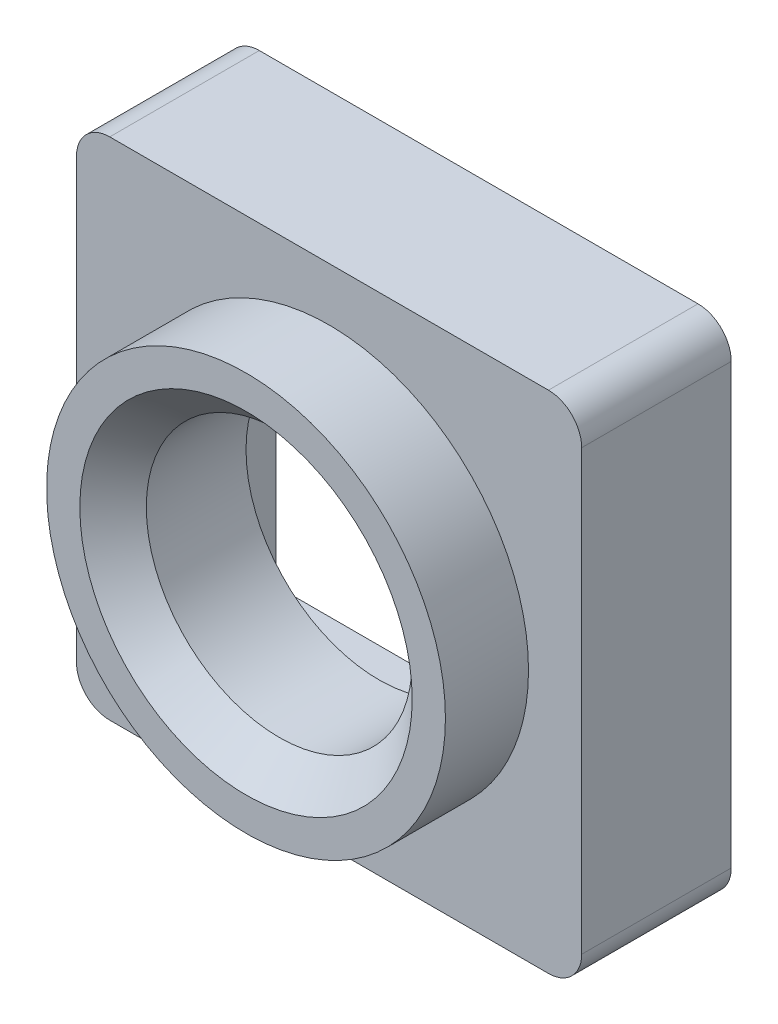
ISO-10303-21;
HEADER;
FILE_DESCRIPTION(('STEP AP214'),'2;1');
FILE_NAME('part.step','',(''),(''),'','','');
FILE_SCHEMA(('AUTOMOTIVE_DESIGN { 1 0 10303 214 1 1 1 1 }'));
ENDSEC;
DATA;
#1=APPLICATION_CONTEXT('core data for automotive mechanical design processes');
#2=APPLICATION_PROTOCOL_DEFINITION('international standard','automotive_design',2000,#1);
#3=PRODUCT_CONTEXT('',#1,'mechanical');
#4=PRODUCT('Part','Part','',(#3));
#5=PRODUCT_RELATED_PRODUCT_CATEGORY('part','',(#4));
#6=PRODUCT_DEFINITION_FORMATION('','',#4);
#7=PRODUCT_DEFINITION_CONTEXT('part definition',#1,'design');
#8=PRODUCT_DEFINITION('design','',#6,#7);
#9=PRODUCT_DEFINITION_SHAPE('','',#8);
#10=(LENGTH_UNIT() NAMED_UNIT(*) SI_UNIT(.MILLI.,.METRE.));
#11=(NAMED_UNIT(*) PLANE_ANGLE_UNIT() SI_UNIT($,.RADIAN.));
#12=(NAMED_UNIT(*) SI_UNIT($,.STERADIAN.) SOLID_ANGLE_UNIT());
#13=UNCERTAINTY_MEASURE_WITH_UNIT(LENGTH_MEASURE(1.E-05),#10,'distance_accuracy_value','');
#14=(GEOMETRIC_REPRESENTATION_CONTEXT(3) GLOBAL_UNCERTAINTY_ASSIGNED_CONTEXT((#13)) GLOBAL_UNIT_ASSIGNED_CONTEXT((#10,
#11,#12)) REPRESENTATION_CONTEXT('',''));
#15=CARTESIAN_POINT('',(0.,0.,0.));
#16=DIRECTION('',(0.,0.,1.));
#17=DIRECTION('',(1.,0.,0.));
#18=AXIS2_PLACEMENT_3D('',#15,#16,#17);
#19=CARTESIAN_POINT('',(0.,0.,2.5));
#20=DIRECTION('',(0.,0.,1.));
#21=DIRECTION('',(1.,0.,0.));
#22=AXIS2_PLACEMENT_3D('',#19,#20,#21);
#23=PLANE('',#22);
#24=CARTESIAN_POINT('',(0.,0.,2.5));
#25=DIRECTION('',(0.,0.,1.));
#26=DIRECTION('',(1.,0.,0.));
#27=AXIS2_PLACEMENT_3D('',#24,#25,#26);
#28=CIRCLE('',#27,5.);
#29=CARTESIAN_POINT('',(5.,0.,2.5));
#30=VERTEX_POINT('',#29);
#31=EDGE_CURVE('E198',#30,#30,#28,.F.);
#32=ORIENTED_EDGE('',*,*,#31,.T.);
#33=EDGE_LOOP('',(#32));
#34=FACE_BOUND('',#33,.T.);
#35=CARTESIAN_POINT('',(0.,0.,2.5));
#36=DIRECTION('',(0.,0.,1.));
#37=DIRECTION('',(1.,0.,0.));
#38=AXIS2_PLACEMENT_3D('',#35,#36,#37);
#39=CIRCLE('',#38,6.);
#40=CARTESIAN_POINT('',(6.,0.,2.5));
#41=VERTEX_POINT('',#40);
#42=EDGE_CURVE('E190',#41,#41,#39,.T.);
#43=ORIENTED_EDGE('',*,*,#42,.T.);
#44=EDGE_LOOP('',(#43));
#45=FACE_BOUND('',#44,.T.);
#46=ADVANCED_FACE('F35',(#34,#45),#23,.T.);
#47=CARTESIAN_POINT('',(0.,0.,2.5));
#48=DIRECTION('',(0.,0.,-1.));
#49=DIRECTION('',(-1.,0.,0.));
#50=AXIS2_PLACEMENT_3D('',#47,#48,#49);
#51=CYLINDRICAL_SURFACE('',#50,6.);
#52=ORIENTED_EDGE('',*,*,#42,.F.);
#53=EDGE_LOOP('',(#52));
#54=FACE_BOUND('',#53,.T.);
#55=CARTESIAN_POINT('',(0.,0.,0.));
#56=DIRECTION('',(0.,0.,1.));
#57=DIRECTION('',(1.,0.,0.));
#58=AXIS2_PLACEMENT_3D('',#55,#56,#57);
#59=CIRCLE('',#58,6.);
#60=CARTESIAN_POINT('',(6.,0.,0.));
#61=VERTEX_POINT('',#60);
#62=EDGE_CURVE('E189',#61,#61,#59,.T.);
#63=ORIENTED_EDGE('',*,*,#62,.T.);
#64=EDGE_LOOP('',(#63));
#65=FACE_BOUND('',#64,.T.);
#66=ADVANCED_FACE('F336',(#54,#65),#51,.T.);
#67=CARTESIAN_POINT('',(0.,0.,2.5));
#68=DIRECTION('',(0.,0.,-1.));
#69=DIRECTION('',(-1.,0.,0.));
#70=AXIS2_PLACEMENT_3D('',#67,#68,#69);
#71=CYLINDRICAL_SURFACE('',#70,4.);
#72=CARTESIAN_POINT('',(0.,0.,1.5));
#73=DIRECTION('',(0.,0.,1.));
#74=DIRECTION('',(1.,0.,0.));
#75=AXIS2_PLACEMENT_3D('',#72,#73,#74);
#76=CIRCLE('',#75,4.);
#77=CARTESIAN_POINT('',(4.,0.,1.5));
#78=VERTEX_POINT('',#77);
#79=EDGE_CURVE('E193',#78,#78,#76,.T.);
#80=ORIENTED_EDGE('',*,*,#79,.T.);
#81=EDGE_LOOP('',(#80));
#82=FACE_BOUND('',#81,.T.);
#83=CARTESIAN_POINT('',(0.,0.,-1.5));
#84=DIRECTION('',(0.,0.,-1.));
#85=DIRECTION('',(-1.,0.,0.));
#86=AXIS2_PLACEMENT_3D('',#83,#84,#85);
#87=CIRCLE('',#86,4.);
#88=CARTESIAN_POINT('',(-4.,0.,-1.5));
#89=VERTEX_POINT('',#88);
#90=EDGE_CURVE('E175',#89,#89,#87,.T.);
#91=ORIENTED_EDGE('',*,*,#90,.T.);
#92=EDGE_LOOP('',(#91));
#93=FACE_BOUND('',#92,.T.);
#94=ADVANCED_FACE('F342',(#82,#93),#71,.F.);
#95=CARTESIAN_POINT('',(0.,0.,1.5));
#96=DIRECTION('',(0.,0.,1.));
#97=DIRECTION('',(1.,0.,0.));
#98=AXIS2_PLACEMENT_3D('',#95,#96,#97);
#99=CONICAL_SURFACE('',#98,4.,0.785398163397449);
#100=ORIENTED_EDGE('',*,*,#31,.F.);
#101=EDGE_LOOP('',(#100));
#102=FACE_BOUND('',#101,.T.);
#103=ORIENTED_EDGE('',*,*,#79,.F.);
#104=EDGE_LOOP('',(#103));
#105=FACE_BOUND('',#104,.T.);
#106=ADVANCED_FACE('F349',(#102,#105),#99,.F.);
#107=CARTESIAN_POINT('',(0.,0.,-1.5));
#108=DIRECTION('',(0.,0.,1.));
#109=DIRECTION('',(1.,0.,0.));
#110=AXIS2_PLACEMENT_3D('',#107,#108,#109);
#111=PLANE('',#110);
#112=DIRECTION('',(-1.,0.,0.));
#113=VECTOR('',#112,1.);
#114=CARTESIAN_POINT('',(6.1,-6.1,-1.5));
#115=LINE('',#114,#113);
#116=CARTESIAN_POINT('',(5.6,-6.1,-1.5));
#117=VERTEX_POINT('',#116);
#118=CARTESIAN_POINT('',(-5.6,-6.1,-1.5));
#119=VERTEX_POINT('',#118);
#120=EDGE_CURVE('E280',#117,#119,#115,.T.);
#121=ORIENTED_EDGE('',*,*,#120,.T.);
#122=CARTESIAN_POINT('',(-5.6,-5.6,-1.5));
#123=DIRECTION('',(0.,0.,1.));
#124=DIRECTION('',(1.,0.,0.));
#125=AXIS2_PLACEMENT_3D('',#122,#123,#124);
#126=CIRCLE('',#125,0.5);
#127=CARTESIAN_POINT('',(-6.1,-5.6,-1.5));
#128=VERTEX_POINT('',#127);
#129=EDGE_CURVE('E238',#119,#128,#126,.F.);
#130=ORIENTED_EDGE('',*,*,#129,.T.);
#131=DIRECTION('',(0.,1.,0.));
#132=VECTOR('',#131,1.);
#133=CARTESIAN_POINT('',(-6.1,-6.1,-1.5));
#134=LINE('',#133,#132);
#135=CARTESIAN_POINT('',(-6.1,5.6,-1.5));
#136=VERTEX_POINT('',#135);
#137=EDGE_CURVE('E467',#128,#136,#134,.T.);
#138=ORIENTED_EDGE('',*,*,#137,.T.);
#139=CARTESIAN_POINT('',(-5.6,5.6,-1.5));
#140=DIRECTION('',(0.,0.,1.));
#141=DIRECTION('',(1.,0.,0.));
#142=AXIS2_PLACEMENT_3D('',#139,#140,#141);
#143=CIRCLE('',#142,0.5);
#144=CARTESIAN_POINT('',(-5.6,6.1,-1.5));
#145=VERTEX_POINT('',#144);
#146=EDGE_CURVE('E232',#136,#145,#143,.F.);
#147=ORIENTED_EDGE('',*,*,#146,.T.);
#148=DIRECTION('',(1.,0.,0.));
#149=VECTOR('',#148,1.);
#150=CARTESIAN_POINT('',(-6.1,6.1,-1.5));
#151=LINE('',#150,#149);
#152=CARTESIAN_POINT('',(5.6,6.1,-1.5));
#153=VERTEX_POINT('',#152);
#154=EDGE_CURVE('E289',#145,#153,#151,.T.);
#155=ORIENTED_EDGE('',*,*,#154,.T.);
#156=CARTESIAN_POINT('',(5.6,5.6,-1.5));
#157=DIRECTION('',(0.,0.,1.));
#158=DIRECTION('',(1.,0.,0.));
#159=AXIS2_PLACEMENT_3D('',#156,#157,#158);
#160=CIRCLE('',#159,0.5);
#161=CARTESIAN_POINT('',(6.1,5.6,-1.5));
#162=VERTEX_POINT('',#161);
#163=EDGE_CURVE('E234',#153,#162,#160,.F.);
#164=ORIENTED_EDGE('',*,*,#163,.T.);
#165=DIRECTION('',(0.,-1.,0.));
#166=VECTOR('',#165,1.);
#167=CARTESIAN_POINT('',(6.1,6.1,-1.5));
#168=LINE('',#167,#166);
#169=CARTESIAN_POINT('',(6.1,-5.6,-1.5));
#170=VERTEX_POINT('',#169);
#171=EDGE_CURVE('E281',#162,#170,#168,.T.);
#172=ORIENTED_EDGE('',*,*,#171,.T.);
#173=CARTESIAN_POINT('',(5.6,-5.6,-1.5));
#174=DIRECTION('',(0.,0.,1.));
#175=DIRECTION('',(1.,0.,0.));
#176=AXIS2_PLACEMENT_3D('',#173,#174,#175);
#177=CIRCLE('',#176,0.5);
#178=EDGE_CURVE('E236',#170,#117,#177,.F.);
#179=ORIENTED_EDGE('',*,*,#178,.T.);
#180=EDGE_LOOP('',(#121,#130,#138,#147,#155,#164,#172,#179));
#181=FACE_BOUND('',#180,.T.);
#182=ORIENTED_EDGE('',*,*,#90,.F.);
#183=EDGE_LOOP('',(#182));
#184=FACE_BOUND('',#183,.T.);
#185=ADVANCED_FACE('F278',(#181,#184),#111,.F.);
#186=CARTESIAN_POINT('',(0.,0.,0.));
#187=DIRECTION('',(0.,0.,1.));
#188=DIRECTION('',(1.,0.,0.));
#189=AXIS2_PLACEMENT_3D('',#186,#187,#188);
#190=PLANE('',#189);
#191=ORIENTED_EDGE('',*,*,#62,.F.);
#192=EDGE_LOOP('',(#191));
#193=FACE_BOUND('',#192,.T.);
#194=DIRECTION('',(0.,1.,0.));
#195=VECTOR('',#194,1.);
#196=CARTESIAN_POINT('',(-7.6,-7.6,0.));
#197=LINE('',#196,#195);
#198=CARTESIAN_POINT('',(-7.6,-6.6,0.));
#199=VERTEX_POINT('',#198);
#200=CARTESIAN_POINT('',(-7.6,6.6,0.));
#201=VERTEX_POINT('',#200);
#202=EDGE_CURVE('E165',#199,#201,#197,.T.);
#203=ORIENTED_EDGE('',*,*,#202,.F.);
#204=CARTESIAN_POINT('',(-6.6,-6.6,0.));
#205=DIRECTION('',(0.,0.,1.));
#206=DIRECTION('',(1.,0.,0.));
#207=AXIS2_PLACEMENT_3D('',#204,#205,#206);
#208=CIRCLE('',#207,1.);
#209=CARTESIAN_POINT('',(-6.6,-7.6,0.));
#210=VERTEX_POINT('',#209);
#211=EDGE_CURVE('E148',#199,#210,#208,.T.);
#212=ORIENTED_EDGE('',*,*,#211,.T.);
#213=DIRECTION('',(-1.,0.,0.));
#214=VECTOR('',#213,1.);
#215=CARTESIAN_POINT('',(7.6,-7.6,0.));
#216=LINE('',#215,#214);
#217=CARTESIAN_POINT('',(6.6,-7.6,0.));
#218=VERTEX_POINT('',#217);
#219=EDGE_CURVE('E187',#218,#210,#216,.T.);
#220=ORIENTED_EDGE('',*,*,#219,.F.);
#221=CARTESIAN_POINT('',(6.6,-6.6,0.));
#222=DIRECTION('',(0.,0.,1.));
#223=DIRECTION('',(1.,0.,0.));
#224=AXIS2_PLACEMENT_3D('',#221,#222,#223);
#225=CIRCLE('',#224,1.);
#226=CARTESIAN_POINT('',(7.6,-6.6,0.));
#227=VERTEX_POINT('',#226);
#228=EDGE_CURVE('E159',#218,#227,#225,.T.);
#229=ORIENTED_EDGE('',*,*,#228,.T.);
#230=DIRECTION('',(0.,-1.,0.));
#231=VECTOR('',#230,1.);
#232=CARTESIAN_POINT('',(7.6,-7.6,0.));
#233=LINE('',#232,#231);
#234=CARTESIAN_POINT('',(7.6,6.6,0.));
#235=VERTEX_POINT('',#234);
#236=EDGE_CURVE('E178',#235,#227,#233,.T.);
#237=ORIENTED_EDGE('',*,*,#236,.F.);
#238=CARTESIAN_POINT('',(6.6,6.6,0.));
#239=DIRECTION('',(0.,0.,1.));
#240=DIRECTION('',(1.,0.,0.));
#241=AXIS2_PLACEMENT_3D('',#238,#239,#240);
#242=CIRCLE('',#241,1.);
#243=CARTESIAN_POINT('',(6.6,7.6,0.));
#244=VERTEX_POINT('',#243);
#245=EDGE_CURVE('E203',#235,#244,#242,.T.);
#246=ORIENTED_EDGE('',*,*,#245,.T.);
#247=DIRECTION('',(1.,0.,0.));
#248=VECTOR('',#247,1.);
#249=CARTESIAN_POINT('',(7.6,7.6,0.));
#250=LINE('',#249,#248);
#251=CARTESIAN_POINT('',(-6.6,7.6,0.));
#252=VERTEX_POINT('',#251);
#253=EDGE_CURVE('E174',#252,#244,#250,.T.);
#254=ORIENTED_EDGE('',*,*,#253,.F.);
#255=CARTESIAN_POINT('',(-6.6,6.6,0.));
#256=DIRECTION('',(0.,0.,1.));
#257=DIRECTION('',(1.,0.,0.));
#258=AXIS2_PLACEMENT_3D('',#255,#256,#257);
#259=CIRCLE('',#258,1.);
#260=EDGE_CURVE('E169',#252,#201,#259,.T.);
#261=ORIENTED_EDGE('',*,*,#260,.T.);
#262=EDGE_LOOP('',(#203,#212,#220,#229,#237,#246,#254,#261));
#263=FACE_BOUND('',#262,.T.);
#264=ADVANCED_FACE('F172',(#193,#263),#190,.T.);
#265=CARTESIAN_POINT('',(-7.6,-7.6,-1.5));
#266=DIRECTION('',(1.,0.,0.));
#267=DIRECTION('',(0.,1.,0.));
#268=AXIS2_PLACEMENT_3D('',#265,#266,#267);
#269=PLANE('',#268);
#270=DIRECTION('',(0.,1.,0.));
#271=VECTOR('',#270,1.);
#272=CARTESIAN_POINT('',(-7.6,-7.6,-4.5));
#273=LINE('',#272,#271);
#274=CARTESIAN_POINT('',(-7.6,-6.6,-4.5));
#275=VERTEX_POINT('',#274);
#276=CARTESIAN_POINT('',(-7.6,6.6,-4.5));
#277=VERTEX_POINT('',#276);
#278=EDGE_CURVE('E168',#275,#277,#273,.T.);
#279=ORIENTED_EDGE('',*,*,#278,.F.);
#280=DIRECTION('',(0.,0.,1.));
#281=VECTOR('',#280,1.);
#282=CARTESIAN_POINT('',(-7.6,-6.6,-1.5));
#283=LINE('',#282,#281);
#284=EDGE_CURVE('E152',#275,#199,#283,.T.);
#285=ORIENTED_EDGE('',*,*,#284,.T.);
#286=ORIENTED_EDGE('',*,*,#202,.T.);
#287=DIRECTION('',(0.,0.,1.));
#288=VECTOR('',#287,1.);
#289=CARTESIAN_POINT('',(-7.6,6.6,-1.5));
#290=LINE('',#289,#288);
#291=EDGE_CURVE('E170',#201,#277,#290,.F.);
#292=ORIENTED_EDGE('',*,*,#291,.T.);
#293=EDGE_LOOP('',(#279,#285,#286,#292));
#294=FACE_BOUND('',#293,.T.);
#295=ADVANCED_FACE('F164',(#294),#269,.F.);
#296=CARTESIAN_POINT('',(7.6,7.6,-1.5));
#297=DIRECTION('',(0.,-1.,0.));
#298=DIRECTION('',(1.,0.,0.));
#299=AXIS2_PLACEMENT_3D('',#296,#297,#298);
#300=PLANE('',#299);
#301=ORIENTED_EDGE('',*,*,#253,.T.);
#302=DIRECTION('',(0.,0.,1.));
#303=VECTOR('',#302,1.);
#304=CARTESIAN_POINT('',(6.6,7.6,-1.5));
#305=LINE('',#304,#303);
#306=CARTESIAN_POINT('',(6.6,7.6,-4.5));
#307=VERTEX_POINT('',#306);
#308=EDGE_CURVE('E225',#244,#307,#305,.F.);
#309=ORIENTED_EDGE('',*,*,#308,.T.);
#310=DIRECTION('',(1.,0.,0.));
#311=VECTOR('',#310,1.);
#312=CARTESIAN_POINT('',(-7.6,7.6,-4.5));
#313=LINE('',#312,#311);
#314=CARTESIAN_POINT('',(-6.6,7.6,-4.5));
#315=VERTEX_POINT('',#314);
#316=EDGE_CURVE('E297',#315,#307,#313,.T.);
#317=ORIENTED_EDGE('',*,*,#316,.F.);
#318=DIRECTION('',(0.,0.,1.));
#319=VECTOR('',#318,1.);
#320=CARTESIAN_POINT('',(-6.6,7.6,-1.5));
#321=LINE('',#320,#319);
#322=EDGE_CURVE('E222',#315,#252,#321,.T.);
#323=ORIENTED_EDGE('',*,*,#322,.T.);
#324=EDGE_LOOP('',(#301,#309,#317,#323));
#325=FACE_BOUND('',#324,.T.);
#326=ADVANCED_FACE('F319',(#325),#300,.F.);
#327=CARTESIAN_POINT('',(7.6,-7.6,-1.5));
#328=DIRECTION('',(-1.,0.,0.));
#329=DIRECTION('',(0.,-1.,0.));
#330=AXIS2_PLACEMENT_3D('',#327,#328,#329);
#331=PLANE('',#330);
#332=ORIENTED_EDGE('',*,*,#236,.T.);
#333=DIRECTION('',(0.,0.,1.));
#334=VECTOR('',#333,1.);
#335=CARTESIAN_POINT('',(7.6,-6.6,-1.5));
#336=LINE('',#335,#334);
#337=CARTESIAN_POINT('',(7.6,-6.6,-4.5));
#338=VERTEX_POINT('',#337);
#339=EDGE_CURVE('E220',#227,#338,#336,.F.);
#340=ORIENTED_EDGE('',*,*,#339,.T.);
#341=DIRECTION('',(0.,-1.,0.));
#342=VECTOR('',#341,1.);
#343=CARTESIAN_POINT('',(7.6,7.6,-4.5));
#344=LINE('',#343,#342);
#345=CARTESIAN_POINT('',(7.6,6.6,-4.5));
#346=VERTEX_POINT('',#345);
#347=EDGE_CURVE('E181',#346,#338,#344,.T.);
#348=ORIENTED_EDGE('',*,*,#347,.F.);
#349=DIRECTION('',(0.,0.,1.));
#350=VECTOR('',#349,1.);
#351=CARTESIAN_POINT('',(7.6,6.6,-1.5));
#352=LINE('',#351,#350);
#353=EDGE_CURVE('E217',#346,#235,#352,.T.);
#354=ORIENTED_EDGE('',*,*,#353,.T.);
#355=EDGE_LOOP('',(#332,#340,#348,#354));
#356=FACE_BOUND('',#355,.T.);
#357=ADVANCED_FACE('F314',(#356),#331,.F.);
#358=CARTESIAN_POINT('',(7.6,-7.6,-1.5));
#359=DIRECTION('',(0.,1.,0.));
#360=DIRECTION('',(0.,0.,1.));
#361=AXIS2_PLACEMENT_3D('',#358,#359,#360);
#362=PLANE('',#361);
#363=ORIENTED_EDGE('',*,*,#219,.T.);
#364=DIRECTION('',(0.,0.,1.));
#365=VECTOR('',#364,1.);
#366=CARTESIAN_POINT('',(-6.6,-7.6,-1.5));
#367=LINE('',#366,#365);
#368=CARTESIAN_POINT('',(-6.6,-7.6,-4.5));
#369=VERTEX_POINT('',#368);
#370=EDGE_CURVE('E153',#210,#369,#367,.F.);
#371=ORIENTED_EDGE('',*,*,#370,.T.);
#372=DIRECTION('',(-1.,0.,0.));
#373=VECTOR('',#372,1.);
#374=CARTESIAN_POINT('',(7.6,-7.6,-4.5));
#375=LINE('',#374,#373);
#376=CARTESIAN_POINT('',(6.6,-7.6,-4.5));
#377=VERTEX_POINT('',#376);
#378=EDGE_CURVE('E293',#377,#369,#375,.T.);
#379=ORIENTED_EDGE('',*,*,#378,.F.);
#380=DIRECTION('',(0.,0.,1.));
#381=VECTOR('',#380,1.);
#382=CARTESIAN_POINT('',(6.6,-7.6,-1.5));
#383=LINE('',#382,#381);
#384=EDGE_CURVE('E158',#377,#218,#383,.T.);
#385=ORIENTED_EDGE('',*,*,#384,.T.);
#386=EDGE_LOOP('',(#363,#371,#379,#385));
#387=FACE_BOUND('',#386,.T.);
#388=ADVANCED_FACE('F312',(#387),#362,.F.);
#389=CARTESIAN_POINT('',(0.,0.,-4.5));
#390=DIRECTION('',(0.,0.,-1.));
#391=DIRECTION('',(-1.,0.,0.));
#392=AXIS2_PLACEMENT_3D('',#389,#390,#391);
#393=PLANE('',#392);
#394=ORIENTED_EDGE('',*,*,#378,.T.);
#395=CARTESIAN_POINT('',(-6.6,-6.6,-4.5));
#396=DIRECTION('',(0.,0.,-1.));
#397=DIRECTION('',(-1.,0.,0.));
#398=AXIS2_PLACEMENT_3D('',#395,#396,#397);
#399=CIRCLE('',#398,1.);
#400=EDGE_CURVE('E215',#369,#275,#399,.T.);
#401=ORIENTED_EDGE('',*,*,#400,.T.);
#402=ORIENTED_EDGE('',*,*,#278,.T.);
#403=CARTESIAN_POINT('',(-6.6,6.6,-4.5));
#404=DIRECTION('',(0.,0.,-1.));
#405=DIRECTION('',(-1.,0.,0.));
#406=AXIS2_PLACEMENT_3D('',#403,#404,#405);
#407=CIRCLE('',#406,1.);
#408=EDGE_CURVE('E209',#277,#315,#407,.T.);
#409=ORIENTED_EDGE('',*,*,#408,.T.);
#410=ORIENTED_EDGE('',*,*,#316,.T.);
#411=CARTESIAN_POINT('',(6.6,6.6,-4.5));
#412=DIRECTION('',(0.,0.,-1.));
#413=DIRECTION('',(-1.,0.,0.));
#414=AXIS2_PLACEMENT_3D('',#411,#412,#413);
#415=CIRCLE('',#414,1.);
#416=EDGE_CURVE('E211',#307,#346,#415,.T.);
#417=ORIENTED_EDGE('',*,*,#416,.T.);
#418=ORIENTED_EDGE('',*,*,#347,.T.);
#419=CARTESIAN_POINT('',(6.6,-6.6,-4.5));
#420=DIRECTION('',(0.,0.,-1.));
#421=DIRECTION('',(-1.,0.,0.));
#422=AXIS2_PLACEMENT_3D('',#419,#420,#421);
#423=CIRCLE('',#422,1.);
#424=EDGE_CURVE('E213',#338,#377,#423,.T.);
#425=ORIENTED_EDGE('',*,*,#424,.T.);
#426=EDGE_LOOP('',(#394,#401,#402,#409,#410,#417,#418,#425));
#427=FACE_BOUND('',#426,.T.);
#428=DIRECTION('',(1.,0.,0.));
#429=VECTOR('',#428,1.);
#430=CARTESIAN_POINT('',(-6.1,6.1,-4.5));
#431=LINE('',#430,#429);
#432=CARTESIAN_POINT('',(-5.6,6.1,-4.5));
#433=VERTEX_POINT('',#432);
#434=CARTESIAN_POINT('',(5.6,6.1,-4.5));
#435=VERTEX_POINT('',#434);
#436=EDGE_CURVE('E272',#433,#435,#431,.T.);
#437=ORIENTED_EDGE('',*,*,#436,.F.);
#438=CARTESIAN_POINT('',(-5.6,5.6,-4.5));
#439=DIRECTION('',(0.,0.,-1.));
#440=DIRECTION('',(-1.,0.,0.));
#441=AXIS2_PLACEMENT_3D('',#438,#439,#440);
#442=CIRCLE('',#441,0.5);
#443=CARTESIAN_POINT('',(-6.1,5.6,-4.5));
#444=VERTEX_POINT('',#443);
#445=EDGE_CURVE('E11',#433,#444,#442,.F.);
#446=ORIENTED_EDGE('',*,*,#445,.T.);
#447=DIRECTION('',(0.,1.,0.));
#448=VECTOR('',#447,1.);
#449=CARTESIAN_POINT('',(-6.1,-6.1,-4.5));
#450=LINE('',#449,#448);
#451=CARTESIAN_POINT('',(-6.1,-5.6,-4.5));
#452=VERTEX_POINT('',#451);
#453=EDGE_CURVE('E285',#452,#444,#450,.T.);
#454=ORIENTED_EDGE('',*,*,#453,.F.);
#455=CARTESIAN_POINT('',(-5.6,-5.6,-4.5));
#456=DIRECTION('',(0.,0.,-1.));
#457=DIRECTION('',(-1.,0.,0.));
#458=AXIS2_PLACEMENT_3D('',#455,#456,#457);
#459=CIRCLE('',#458,0.5);
#460=CARTESIAN_POINT('',(-5.6,-6.1,-4.5));
#461=VERTEX_POINT('',#460);
#462=EDGE_CURVE('E254',#452,#461,#459,.F.);
#463=ORIENTED_EDGE('',*,*,#462,.T.);
#464=DIRECTION('',(-1.,0.,0.));
#465=VECTOR('',#464,1.);
#466=CARTESIAN_POINT('',(6.1,-6.1,-4.5));
#467=LINE('',#466,#465);
#468=CARTESIAN_POINT('',(5.6,-6.1,-4.5));
#469=VERTEX_POINT('',#468);
#470=EDGE_CURVE('E263',#469,#461,#467,.T.);
#471=ORIENTED_EDGE('',*,*,#470,.F.);
#472=CARTESIAN_POINT('',(5.6,-5.6,-4.5));
#473=DIRECTION('',(0.,0.,-1.));
#474=DIRECTION('',(-1.,0.,0.));
#475=AXIS2_PLACEMENT_3D('',#472,#473,#474);
#476=CIRCLE('',#475,0.5);
#477=CARTESIAN_POINT('',(6.1,-5.6,-4.5));
#478=VERTEX_POINT('',#477);
#479=EDGE_CURVE('E256',#469,#478,#476,.F.);
#480=ORIENTED_EDGE('',*,*,#479,.T.);
#481=DIRECTION('',(0.,-1.,0.));
#482=VECTOR('',#481,1.);
#483=CARTESIAN_POINT('',(6.1,6.1,-4.5));
#484=LINE('',#483,#482);
#485=CARTESIAN_POINT('',(6.1,5.6,-4.5));
#486=VERTEX_POINT('',#485);
#487=EDGE_CURVE('E261',#486,#478,#484,.T.);
#488=ORIENTED_EDGE('',*,*,#487,.F.);
#489=CARTESIAN_POINT('',(5.6,5.6,-4.5));
#490=DIRECTION('',(0.,0.,-1.));
#491=DIRECTION('',(-1.,0.,0.));
#492=AXIS2_PLACEMENT_3D('',#489,#490,#491);
#493=CIRCLE('',#492,0.5);
#494=EDGE_CURVE('E43',#486,#435,#493,.F.);
#495=ORIENTED_EDGE('',*,*,#494,.T.);
#496=EDGE_LOOP('',(#437,#446,#454,#463,#471,#480,#488,#495));
#497=FACE_BOUND('',#496,.T.);
#498=ADVANCED_FACE('F260',(#427,#497),#393,.T.);
#499=CARTESIAN_POINT('',(-6.1,-6.1,-4.5));
#500=DIRECTION('',(1.,0.,0.));
#501=DIRECTION('',(0.,0.,-1.));
#502=AXIS2_PLACEMENT_3D('',#499,#500,#501);
#503=PLANE('',#502);
#504=ORIENTED_EDGE('',*,*,#137,.F.);
#505=DIRECTION('',(0.,0.,1.));
#506=VECTOR('',#505,1.);
#507=CARTESIAN_POINT('',(-6.1,-5.6,-4.5));
#508=LINE('',#507,#506);
#509=EDGE_CURVE('E243',#128,#452,#508,.F.);
#510=ORIENTED_EDGE('',*,*,#509,.T.);
#511=ORIENTED_EDGE('',*,*,#453,.T.);
#512=DIRECTION('',(0.,0.,1.));
#513=VECTOR('',#512,1.);
#514=CARTESIAN_POINT('',(-6.1,5.6,-1.5));
#515=LINE('',#514,#513);
#516=EDGE_CURVE('E240',#444,#136,#515,.T.);
#517=ORIENTED_EDGE('',*,*,#516,.T.);
#518=EDGE_LOOP('',(#504,#510,#511,#517));
#519=FACE_BOUND('',#518,.T.);
#520=ADVANCED_FACE('F390',(#519),#503,.T.);
#521=CARTESIAN_POINT('',(-6.1,6.1,-4.5));
#522=DIRECTION('',(0.,-1.,0.));
#523=DIRECTION('',(0.,0.,-1.));
#524=AXIS2_PLACEMENT_3D('',#521,#522,#523);
#525=PLANE('',#524);
#526=ORIENTED_EDGE('',*,*,#436,.T.);
#527=DIRECTION('',(0.,0.,1.));
#528=VECTOR('',#527,1.);
#529=CARTESIAN_POINT('',(5.6,6.1,-1.5));
#530=LINE('',#529,#528);
#531=EDGE_CURVE('E251',#435,#153,#530,.T.);
#532=ORIENTED_EDGE('',*,*,#531,.T.);
#533=ORIENTED_EDGE('',*,*,#154,.F.);
#534=DIRECTION('',(0.,0.,1.));
#535=VECTOR('',#534,1.);
#536=CARTESIAN_POINT('',(-5.6,6.1,-4.5));
#537=LINE('',#536,#535);
#538=EDGE_CURVE('E56',#145,#433,#537,.F.);
#539=ORIENTED_EDGE('',*,*,#538,.T.);
#540=EDGE_LOOP('',(#526,#532,#533,#539));
#541=FACE_BOUND('',#540,.T.);
#542=ADVANCED_FACE('F401',(#541),#525,.T.);
#543=CARTESIAN_POINT('',(6.1,6.1,-4.5));
#544=DIRECTION('',(-1.,0.,0.));
#545=DIRECTION('',(0.,0.,1.));
#546=AXIS2_PLACEMENT_3D('',#543,#544,#545);
#547=PLANE('',#546);
#548=ORIENTED_EDGE('',*,*,#487,.T.);
#549=DIRECTION('',(0.,0.,1.));
#550=VECTOR('',#549,1.);
#551=CARTESIAN_POINT('',(6.1,-5.6,-1.5));
#552=LINE('',#551,#550);
#553=EDGE_CURVE('E247',#478,#170,#552,.T.);
#554=ORIENTED_EDGE('',*,*,#553,.T.);
#555=ORIENTED_EDGE('',*,*,#171,.F.);
#556=DIRECTION('',(0.,0.,1.));
#557=VECTOR('',#556,1.);
#558=CARTESIAN_POINT('',(6.1,5.6,-4.5));
#559=LINE('',#558,#557);
#560=EDGE_CURVE('E245',#162,#486,#559,.F.);
#561=ORIENTED_EDGE('',*,*,#560,.T.);
#562=EDGE_LOOP('',(#548,#554,#555,#561));
#563=FACE_BOUND('',#562,.T.);
#564=ADVANCED_FACE('F268',(#563),#547,.T.);
#565=CARTESIAN_POINT('',(6.1,-6.1,-4.5));
#566=DIRECTION('',(0.,1.,0.));
#567=DIRECTION('',(0.,0.,1.));
#568=AXIS2_PLACEMENT_3D('',#565,#566,#567);
#569=PLANE('',#568);
#570=ORIENTED_EDGE('',*,*,#470,.T.);
#571=DIRECTION('',(0.,0.,1.));
#572=VECTOR('',#571,1.);
#573=CARTESIAN_POINT('',(-5.6,-6.1,-1.5));
#574=LINE('',#573,#572);
#575=EDGE_CURVE('E229',#461,#119,#574,.T.);
#576=ORIENTED_EDGE('',*,*,#575,.T.);
#577=ORIENTED_EDGE('',*,*,#120,.F.);
#578=DIRECTION('',(0.,0.,1.));
#579=VECTOR('',#578,1.);
#580=CARTESIAN_POINT('',(5.6,-6.1,-4.5));
#581=LINE('',#580,#579);
#582=EDGE_CURVE('E227',#117,#469,#581,.F.);
#583=ORIENTED_EDGE('',*,*,#582,.T.);
#584=EDGE_LOOP('',(#570,#576,#577,#583));
#585=FACE_BOUND('',#584,.T.);
#586=ADVANCED_FACE('F283',(#585),#569,.T.);
#587=CARTESIAN_POINT('',(-6.6,-6.6,-1.5));
#588=DIRECTION('',(0.,0.,1.));
#589=DIRECTION('',(1.,0.,0.));
#590=AXIS2_PLACEMENT_3D('',#587,#588,#589);
#591=CYLINDRICAL_SURFACE('',#590,1.);
#592=ORIENTED_EDGE('',*,*,#400,.F.);
#593=ORIENTED_EDGE('',*,*,#370,.F.);
#594=ORIENTED_EDGE('',*,*,#211,.F.);
#595=ORIENTED_EDGE('',*,*,#284,.F.);
#596=EDGE_LOOP('',(#592,#593,#594,#595));
#597=FACE_BOUND('',#596,.T.);
#598=ADVANCED_FACE('F151',(#597),#591,.T.);
#599=CARTESIAN_POINT('',(6.6,-6.6,-1.5));
#600=DIRECTION('',(0.,0.,1.));
#601=DIRECTION('',(1.,0.,0.));
#602=AXIS2_PLACEMENT_3D('',#599,#600,#601);
#603=CYLINDRICAL_SURFACE('',#602,1.);
#604=ORIENTED_EDGE('',*,*,#424,.F.);
#605=ORIENTED_EDGE('',*,*,#339,.F.);
#606=ORIENTED_EDGE('',*,*,#228,.F.);
#607=ORIENTED_EDGE('',*,*,#384,.F.);
#608=EDGE_LOOP('',(#604,#605,#606,#607));
#609=FACE_BOUND('',#608,.T.);
#610=ADVANCED_FACE('F310',(#609),#603,.T.);
#611=CARTESIAN_POINT('',(6.6,6.6,-1.5));
#612=DIRECTION('',(0.,0.,1.));
#613=DIRECTION('',(1.,0.,0.));
#614=AXIS2_PLACEMENT_3D('',#611,#612,#613);
#615=CYLINDRICAL_SURFACE('',#614,1.);
#616=ORIENTED_EDGE('',*,*,#416,.F.);
#617=ORIENTED_EDGE('',*,*,#308,.F.);
#618=ORIENTED_EDGE('',*,*,#245,.F.);
#619=ORIENTED_EDGE('',*,*,#353,.F.);
#620=EDGE_LOOP('',(#616,#617,#618,#619));
#621=FACE_BOUND('',#620,.T.);
#622=ADVANCED_FACE('F316',(#621),#615,.T.);
#623=CARTESIAN_POINT('',(-6.6,6.6,-1.5));
#624=DIRECTION('',(0.,0.,1.));
#625=DIRECTION('',(1.,0.,0.));
#626=AXIS2_PLACEMENT_3D('',#623,#624,#625);
#627=CYLINDRICAL_SURFACE('',#626,1.);
#628=ORIENTED_EDGE('',*,*,#408,.F.);
#629=ORIENTED_EDGE('',*,*,#291,.F.);
#630=ORIENTED_EDGE('',*,*,#260,.F.);
#631=ORIENTED_EDGE('',*,*,#322,.F.);
#632=EDGE_LOOP('',(#628,#629,#630,#631));
#633=FACE_BOUND('',#632,.T.);
#634=ADVANCED_FACE('F324',(#633),#627,.T.);
#635=CARTESIAN_POINT('',(-5.6,-5.6,-4.5));
#636=DIRECTION('',(0.,0.,-1.));
#637=DIRECTION('',(-1.,0.,0.));
#638=AXIS2_PLACEMENT_3D('',#635,#636,#637);
#639=CYLINDRICAL_SURFACE('',#638,0.5);
#640=ORIENTED_EDGE('',*,*,#462,.F.);
#641=ORIENTED_EDGE('',*,*,#509,.F.);
#642=ORIENTED_EDGE('',*,*,#129,.F.);
#643=ORIENTED_EDGE('',*,*,#575,.F.);
#644=EDGE_LOOP('',(#640,#641,#642,#643));
#645=FACE_BOUND('',#644,.T.);
#646=ADVANCED_FACE('F326',(#645),#639,.F.);
#647=CARTESIAN_POINT('',(5.6,-5.6,-4.5));
#648=DIRECTION('',(0.,0.,-1.));
#649=DIRECTION('',(-1.,0.,0.));
#650=AXIS2_PLACEMENT_3D('',#647,#648,#649);
#651=CYLINDRICAL_SURFACE('',#650,0.5);
#652=ORIENTED_EDGE('',*,*,#479,.F.);
#653=ORIENTED_EDGE('',*,*,#582,.F.);
#654=ORIENTED_EDGE('',*,*,#178,.F.);
#655=ORIENTED_EDGE('',*,*,#553,.F.);
#656=EDGE_LOOP('',(#652,#653,#654,#655));
#657=FACE_BOUND('',#656,.T.);
#658=ADVANCED_FACE('F274',(#657),#651,.F.);
#659=CARTESIAN_POINT('',(5.6,5.6,-4.5));
#660=DIRECTION('',(0.,0.,-1.));
#661=DIRECTION('',(-1.,0.,0.));
#662=AXIS2_PLACEMENT_3D('',#659,#660,#661);
#663=CYLINDRICAL_SURFACE('',#662,0.5);
#664=ORIENTED_EDGE('',*,*,#494,.F.);
#665=ORIENTED_EDGE('',*,*,#560,.F.);
#666=ORIENTED_EDGE('',*,*,#163,.F.);
#667=ORIENTED_EDGE('',*,*,#531,.F.);
#668=EDGE_LOOP('',(#664,#665,#666,#667));
#669=FACE_BOUND('',#668,.T.);
#670=ADVANCED_FACE('F440',(#669),#663,.F.);
#671=CARTESIAN_POINT('',(-5.6,5.6,-4.5));
#672=DIRECTION('',(0.,0.,-1.));
#673=DIRECTION('',(-1.,0.,0.));
#674=AXIS2_PLACEMENT_3D('',#671,#672,#673);
#675=CYLINDRICAL_SURFACE('',#674,0.5);
#676=ORIENTED_EDGE('',*,*,#445,.F.);
#677=ORIENTED_EDGE('',*,*,#538,.F.);
#678=ORIENTED_EDGE('',*,*,#146,.F.);
#679=ORIENTED_EDGE('',*,*,#516,.F.);
#680=EDGE_LOOP('',(#676,#677,#678,#679));
#681=FACE_BOUND('',#680,.T.);
#682=ADVANCED_FACE('F37',(#681),#675,.F.);
#683=CLOSED_SHELL('',(#46,#66,#94,#106,#185,#264,#295,#326,#357,#388,#498,#520,#542,#564,#586,
#598,#610,#622,#634,#646,#658,#670,#682));
#684=MANIFOLD_SOLID_BREP('B2',#683);
#685=ADVANCED_BREP_SHAPE_REPRESENTATION('',(#18,#684),#14);
#686=SHAPE_DEFINITION_REPRESENTATION(#9,#685);
ENDSEC;
END-ISO-10303-21;
